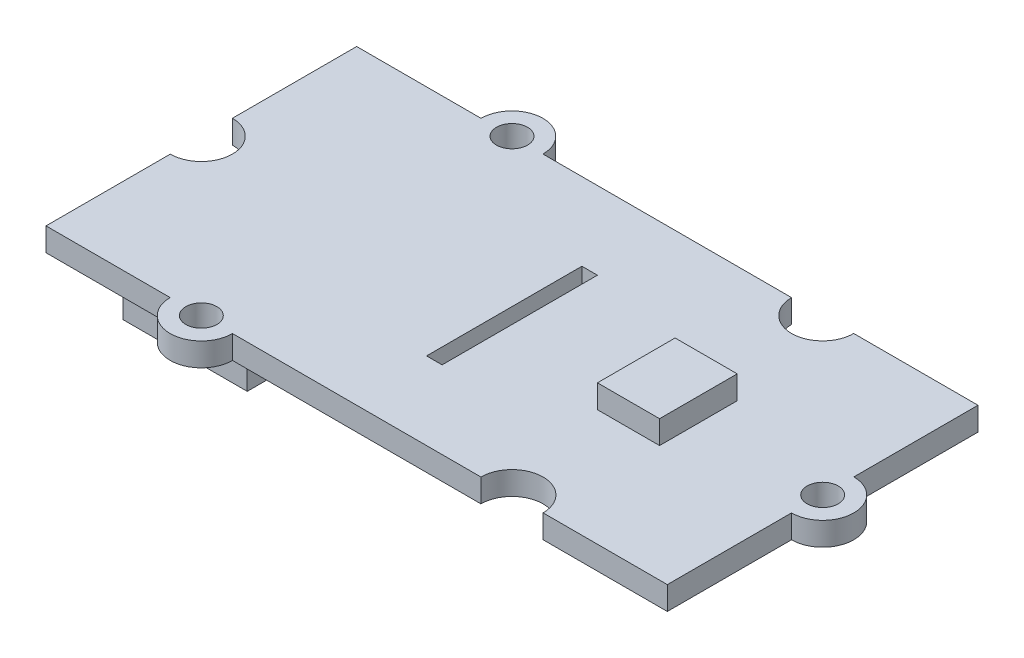
ISO-10303-21;
HEADER;
FILE_DESCRIPTION(('STEP AP214'),'2;1');
FILE_NAME('part.step','',(''),(''),'','','');
FILE_SCHEMA(('AUTOMOTIVE_DESIGN { 1 0 10303 214 1 1 1 1 }'));
ENDSEC;
DATA;
#1=APPLICATION_CONTEXT('core data for automotive mechanical design processes');
#2=APPLICATION_PROTOCOL_DEFINITION('international standard','automotive_design',2000,#1);
#3=PRODUCT_CONTEXT('',#1,'mechanical');
#4=PRODUCT('Part','Part','',(#3));
#5=PRODUCT_RELATED_PRODUCT_CATEGORY('part','',(#4));
#6=PRODUCT_DEFINITION_FORMATION('','',#4);
#7=PRODUCT_DEFINITION_CONTEXT('part definition',#1,'design');
#8=PRODUCT_DEFINITION('design','',#6,#7);
#9=PRODUCT_DEFINITION_SHAPE('','',#8);
#10=(LENGTH_UNIT() NAMED_UNIT(*) SI_UNIT(.MILLI.,.METRE.));
#11=(NAMED_UNIT(*) PLANE_ANGLE_UNIT() SI_UNIT($,.RADIAN.));
#12=(NAMED_UNIT(*) SI_UNIT($,.STERADIAN.) SOLID_ANGLE_UNIT());
#13=UNCERTAINTY_MEASURE_WITH_UNIT(LENGTH_MEASURE(1.E-05),#10,'distance_accuracy_value','');
#14=(GEOMETRIC_REPRESENTATION_CONTEXT(3) GLOBAL_UNCERTAINTY_ASSIGNED_CONTEXT((#13)) GLOBAL_UNIT_ASSIGNED_CONTEXT((#10,
#11,#12)) REPRESENTATION_CONTEXT('',''));
#15=CARTESIAN_POINT('',(0.,0.,0.));
#16=DIRECTION('',(0.,0.,1.));
#17=DIRECTION('',(1.,0.,0.));
#18=AXIS2_PLACEMENT_3D('',#15,#16,#17);
#19=CARTESIAN_POINT('',(0.,1.5,0.));
#20=DIRECTION('',(0.,1.,0.));
#21=DIRECTION('',(0.,0.,1.));
#22=AXIS2_PLACEMENT_3D('',#19,#20,#21);
#23=PLANE('',#22);
#24=CARTESIAN_POINT('',(-10.,1.5,10.));
#25=DIRECTION('',(0.,1.,0.));
#26=DIRECTION('',(0.,0.,1.));
#27=AXIS2_PLACEMENT_3D('',#24,#25,#26);
#28=CIRCLE('',#27,1.);
#29=CARTESIAN_POINT('',(-10.,1.5,11.));
#30=VERTEX_POINT('',#29);
#31=EDGE_CURVE('E298',#30,#30,#28,.T.);
#32=ORIENTED_EDGE('',*,*,#31,.F.);
#33=EDGE_LOOP('',(#32));
#34=FACE_BOUND('',#33,.T.);
#35=CARTESIAN_POINT('',(20.,1.5,0.));
#36=DIRECTION('',(0.,1.,0.));
#37=DIRECTION('',(0.,0.,1.));
#38=AXIS2_PLACEMENT_3D('',#35,#36,#37);
#39=CIRCLE('',#38,1.);
#40=CARTESIAN_POINT('',(20.,1.5,1.));
#41=VERTEX_POINT('',#40);
#42=EDGE_CURVE('E301',#41,#41,#39,.T.);
#43=ORIENTED_EDGE('',*,*,#42,.F.);
#44=EDGE_LOOP('',(#43));
#45=FACE_BOUND('',#44,.T.);
#46=DIRECTION('',(1.,0.,0.));
#47=VECTOR('',#46,1.);
#48=CARTESIAN_POINT('',(0.,1.5,-10.));
#49=LINE('',#48,#47);
#50=CARTESIAN_POINT('',(-8.00644597857988,1.5,-10.));
#51=VERTEX_POINT('',#50);
#52=CARTESIAN_POINT('',(8.,1.5,-10.));
#53=VERTEX_POINT('',#52);
#54=EDGE_CURVE('E305',#51,#53,#49,.T.);
#55=ORIENTED_EDGE('',*,*,#54,.F.);
#56=CARTESIAN_POINT('',(-10.,1.5,-10.));
#57=DIRECTION('',(0.,1.,0.));
#58=DIRECTION('',(0.,0.,1.));
#59=AXIS2_PLACEMENT_3D('',#56,#57,#58);
#60=CIRCLE('',#59,1.99355402142012);
#61=CARTESIAN_POINT('',(-11.9935540214201,1.5,-10.));
#62=VERTEX_POINT('',#61);
#63=EDGE_CURVE('E308',#51,#62,#60,.T.);
#64=ORIENTED_EDGE('',*,*,#63,.T.);
#65=CARTESIAN_POINT('',(-20.,1.5,-10.));
#66=VERTEX_POINT('',#65);
#67=EDGE_CURVE('E310',#66,#62,#49,.T.);
#68=ORIENTED_EDGE('',*,*,#67,.F.);
#69=DIRECTION('',(0.,0.,-1.));
#70=VECTOR('',#69,1.);
#71=CARTESIAN_POINT('',(-20.,1.5,0.));
#72=LINE('',#71,#70);
#73=CARTESIAN_POINT('',(-20.,1.5,-2.));
#74=VERTEX_POINT('',#73);
#75=EDGE_CURVE('E312',#74,#66,#72,.T.);
#76=ORIENTED_EDGE('',*,*,#75,.F.);
#77=CARTESIAN_POINT('',(-20.,1.5,0.));
#78=DIRECTION('',(0.,1.,0.));
#79=DIRECTION('',(0.,0.,1.));
#80=AXIS2_PLACEMENT_3D('',#77,#78,#79);
#81=CIRCLE('',#80,2.);
#82=CARTESIAN_POINT('',(-20.,1.5,2.));
#83=VERTEX_POINT('',#82);
#84=EDGE_CURVE('E315',#83,#74,#81,.T.);
#85=ORIENTED_EDGE('',*,*,#84,.F.);
#86=CARTESIAN_POINT('',(-20.,1.5,10.));
#87=VERTEX_POINT('',#86);
#88=EDGE_CURVE('E316',#87,#83,#72,.T.);
#89=ORIENTED_EDGE('',*,*,#88,.F.);
#90=DIRECTION('',(1.,0.,0.));
#91=VECTOR('',#90,1.);
#92=CARTESIAN_POINT('',(0.,1.5,10.));
#93=LINE('',#92,#91);
#94=CARTESIAN_POINT('',(-12.0064459785799,1.5,10.));
#95=VERTEX_POINT('',#94);
#96=EDGE_CURVE('E319',#87,#95,#93,.T.);
#97=ORIENTED_EDGE('',*,*,#96,.T.);
#98=CARTESIAN_POINT('',(-10.,1.5,10.));
#99=DIRECTION('',(0.,1.,0.));
#100=DIRECTION('',(0.,0.,1.));
#101=AXIS2_PLACEMENT_3D('',#98,#99,#100);
#102=CIRCLE('',#101,2.00644597857989);
#103=CARTESIAN_POINT('',(-7.99355402142011,1.5,10.));
#104=VERTEX_POINT('',#103);
#105=EDGE_CURVE('E322',#95,#104,#102,.T.);
#106=ORIENTED_EDGE('',*,*,#105,.T.);
#107=CARTESIAN_POINT('',(8.,1.5,10.));
#108=VERTEX_POINT('',#107);
#109=EDGE_CURVE('E324',#104,#108,#93,.T.);
#110=ORIENTED_EDGE('',*,*,#109,.T.);
#111=CARTESIAN_POINT('',(10.,1.5,10.));
#112=DIRECTION('',(0.,1.,0.));
#113=DIRECTION('',(0.,0.,1.));
#114=AXIS2_PLACEMENT_3D('',#111,#112,#113);
#115=CIRCLE('',#114,2.);
#116=CARTESIAN_POINT('',(12.,1.5,10.));
#117=VERTEX_POINT('',#116);
#118=EDGE_CURVE('E327',#117,#108,#115,.T.);
#119=ORIENTED_EDGE('',*,*,#118,.F.);
#120=CARTESIAN_POINT('',(20.,1.5,10.));
#121=VERTEX_POINT('',#120);
#122=EDGE_CURVE('E323',#117,#121,#93,.T.);
#123=ORIENTED_EDGE('',*,*,#122,.T.);
#124=DIRECTION('',(0.,0.,-1.));
#125=VECTOR('',#124,1.);
#126=CARTESIAN_POINT('',(20.,1.5,0.));
#127=LINE('',#126,#125);
#128=CARTESIAN_POINT('',(20.,1.5,2.00644597857989));
#129=VERTEX_POINT('',#128);
#130=EDGE_CURVE('E330',#121,#129,#127,.T.);
#131=ORIENTED_EDGE('',*,*,#130,.T.);
#132=CARTESIAN_POINT('',(20.,1.5,0.));
#133=DIRECTION('',(0.,1.,0.));
#134=DIRECTION('',(0.,0.,1.));
#135=AXIS2_PLACEMENT_3D('',#132,#133,#134);
#136=CIRCLE('',#135,2.00644597857989);
#137=CARTESIAN_POINT('',(20.,1.5,-2.00644597857989));
#138=VERTEX_POINT('',#137);
#139=EDGE_CURVE('E333',#129,#138,#136,.T.);
#140=ORIENTED_EDGE('',*,*,#139,.T.);
#141=CARTESIAN_POINT('',(20.,1.5,-10.));
#142=VERTEX_POINT('',#141);
#143=EDGE_CURVE('E334',#138,#142,#127,.T.);
#144=ORIENTED_EDGE('',*,*,#143,.T.);
#145=CARTESIAN_POINT('',(12.,1.5,-10.));
#146=VERTEX_POINT('',#145);
#147=EDGE_CURVE('E309',#146,#142,#49,.T.);
#148=ORIENTED_EDGE('',*,*,#147,.F.);
#149=CARTESIAN_POINT('',(10.,1.5,-10.));
#150=DIRECTION('',(0.,1.,0.));
#151=DIRECTION('',(0.,0.,1.));
#152=AXIS2_PLACEMENT_3D('',#149,#150,#151);
#153=CIRCLE('',#152,2.);
#154=EDGE_CURVE('E337',#53,#146,#153,.T.);
#155=ORIENTED_EDGE('',*,*,#154,.F.);
#156=EDGE_LOOP('',(#55,#64,#68,#76,#85,#89,#97,#106,#110,#119,#123,#131,#140,#144,#148,#155));
#157=FACE_BOUND('',#156,.T.);
#158=CARTESIAN_POINT('',(-10.,1.5,-10.));
#159=DIRECTION('',(0.,1.,0.));
#160=DIRECTION('',(0.,0.,1.));
#161=AXIS2_PLACEMENT_3D('',#158,#159,#160);
#162=CIRCLE('',#161,1.);
#163=CARTESIAN_POINT('',(-10.,1.5,-9.));
#164=VERTEX_POINT('',#163);
#165=EDGE_CURVE('E340',#164,#164,#162,.T.);
#166=ORIENTED_EDGE('',*,*,#165,.F.);
#167=EDGE_LOOP('',(#166));
#168=FACE_BOUND('',#167,.T.);
#169=DIRECTION('',(0.,0.,-1.));
#170=VECTOR('',#169,1.);
#171=CARTESIAN_POINT('',(0.5,1.5,0.));
#172=LINE('',#171,#170);
#173=CARTESIAN_POINT('',(0.5,1.5,5.));
#174=VERTEX_POINT('',#173);
#175=CARTESIAN_POINT('',(0.5,1.5,-5.));
#176=VERTEX_POINT('',#175);
#177=EDGE_CURVE('E343',#174,#176,#172,.T.);
#178=ORIENTED_EDGE('',*,*,#177,.F.);
#179=DIRECTION('',(1.,0.,0.));
#180=VECTOR('',#179,1.);
#181=CARTESIAN_POINT('',(0.,1.5,5.));
#182=LINE('',#181,#180);
#183=CARTESIAN_POINT('',(-0.5,1.5,5.));
#184=VERTEX_POINT('',#183);
#185=EDGE_CURVE('E346',#184,#174,#182,.T.);
#186=ORIENTED_EDGE('',*,*,#185,.F.);
#187=DIRECTION('',(0.,0.,-1.));
#188=VECTOR('',#187,1.);
#189=CARTESIAN_POINT('',(-0.5,1.5,0.));
#190=LINE('',#189,#188);
#191=CARTESIAN_POINT('',(-0.5,1.5,-5.));
#192=VERTEX_POINT('',#191);
#193=EDGE_CURVE('E349',#184,#192,#190,.T.);
#194=ORIENTED_EDGE('',*,*,#193,.T.);
#195=DIRECTION('',(1.,0.,0.));
#196=VECTOR('',#195,1.);
#197=CARTESIAN_POINT('',(0.,1.5,-5.));
#198=LINE('',#197,#196);
#199=EDGE_CURVE('E352',#192,#176,#198,.T.);
#200=ORIENTED_EDGE('',*,*,#199,.T.);
#201=EDGE_LOOP('',(#178,#186,#194,#200));
#202=FACE_BOUND('',#201,.T.);
#203=DIRECTION('',(-1.,0.,0.));
#204=VECTOR('',#203,1.);
#205=CARTESIAN_POINT('',(8.,1.5,-2.5));
#206=LINE('',#205,#204);
#207=CARTESIAN_POINT('',(12.,1.5,-2.5));
#208=VERTEX_POINT('',#207);
#209=CARTESIAN_POINT('',(8.,1.5,-2.5));
#210=VERTEX_POINT('',#209);
#211=EDGE_CURVE('E284',#208,#210,#206,.T.);
#212=ORIENTED_EDGE('',*,*,#211,.F.);
#213=DIRECTION('',(0.,0.,-1.));
#214=VECTOR('',#213,1.);
#215=CARTESIAN_POINT('',(12.,1.5,2.5));
#216=LINE('',#215,#214);
#217=CARTESIAN_POINT('',(12.,1.5,2.5));
#218=VERTEX_POINT('',#217);
#219=EDGE_CURVE('E267',#218,#208,#216,.T.);
#220=ORIENTED_EDGE('',*,*,#219,.F.);
#221=DIRECTION('',(1.,0.,0.));
#222=VECTOR('',#221,1.);
#223=CARTESIAN_POINT('',(8.,1.5,2.5));
#224=LINE('',#223,#222);
#225=CARTESIAN_POINT('',(8.,1.5,2.5));
#226=VERTEX_POINT('',#225);
#227=EDGE_CURVE('E275',#226,#218,#224,.T.);
#228=ORIENTED_EDGE('',*,*,#227,.F.);
#229=DIRECTION('',(0.,0.,1.));
#230=VECTOR('',#229,1.);
#231=CARTESIAN_POINT('',(8.,1.5,2.5));
#232=LINE('',#231,#230);
#233=EDGE_CURVE('E286',#210,#226,#232,.T.);
#234=ORIENTED_EDGE('',*,*,#233,.F.);
#235=EDGE_LOOP('',(#212,#220,#228,#234));
#236=FACE_BOUND('',#235,.T.);
#237=ADVANCED_FACE('F38',(#34,#45,#157,#168,#202,#236),#23,.T.);
#238=CARTESIAN_POINT('',(0.5,1.5,0.));
#239=DIRECTION('',(-1.,0.,0.));
#240=DIRECTION('',(0.,0.,1.));
#241=AXIS2_PLACEMENT_3D('',#238,#239,#240);
#242=PLANE('',#241);
#243=DIRECTION('',(0.,0.,-1.));
#244=VECTOR('',#243,1.);
#245=CARTESIAN_POINT('',(0.5,0.,0.));
#246=LINE('',#245,#244);
#247=CARTESIAN_POINT('',(0.5,0.,5.));
#248=VERTEX_POINT('',#247);
#249=CARTESIAN_POINT('',(0.5,0.,-5.));
#250=VERTEX_POINT('',#249);
#251=EDGE_CURVE('E401',#248,#250,#246,.T.);
#252=ORIENTED_EDGE('',*,*,#251,.F.);
#253=DIRECTION('',(0.,-1.,0.));
#254=VECTOR('',#253,1.);
#255=CARTESIAN_POINT('',(0.5,1.5,5.));
#256=LINE('',#255,#254);
#257=EDGE_CURVE('E47',#174,#248,#256,.T.);
#258=ORIENTED_EDGE('',*,*,#257,.F.);
#259=ORIENTED_EDGE('',*,*,#177,.T.);
#260=DIRECTION('',(0.,-1.,0.));
#261=VECTOR('',#260,1.);
#262=CARTESIAN_POINT('',(0.5,1.5,-5.));
#263=LINE('',#262,#261);
#264=EDGE_CURVE('E412',#176,#250,#263,.T.);
#265=ORIENTED_EDGE('',*,*,#264,.T.);
#266=EDGE_LOOP('',(#252,#258,#259,#265));
#267=FACE_BOUND('',#266,.T.);
#268=ADVANCED_FACE('F553',(#267),#242,.T.);
#269=CARTESIAN_POINT('',(0.,1.5,5.));
#270=DIRECTION('',(0.,0.,-1.));
#271=DIRECTION('',(-1.,0.,0.));
#272=AXIS2_PLACEMENT_3D('',#269,#270,#271);
#273=PLANE('',#272);
#274=DIRECTION('',(1.,0.,0.));
#275=VECTOR('',#274,1.);
#276=CARTESIAN_POINT('',(0.,0.,5.));
#277=LINE('',#276,#275);
#278=CARTESIAN_POINT('',(-0.5,0.,5.));
#279=VERTEX_POINT('',#278);
#280=EDGE_CURVE('E404',#279,#248,#277,.T.);
#281=ORIENTED_EDGE('',*,*,#280,.F.);
#282=DIRECTION('',(0.,-1.,0.));
#283=VECTOR('',#282,1.);
#284=CARTESIAN_POINT('',(-0.5,1.5,5.));
#285=LINE('',#284,#283);
#286=EDGE_CURVE('E417',#184,#279,#285,.T.);
#287=ORIENTED_EDGE('',*,*,#286,.F.);
#288=ORIENTED_EDGE('',*,*,#185,.T.);
#289=ORIENTED_EDGE('',*,*,#257,.T.);
#290=EDGE_LOOP('',(#281,#287,#288,#289));
#291=FACE_BOUND('',#290,.T.);
#292=ADVANCED_FACE('F559',(#291),#273,.T.);
#293=CARTESIAN_POINT('',(-0.5,1.5,0.));
#294=DIRECTION('',(-1.,0.,0.));
#295=DIRECTION('',(0.,0.,1.));
#296=AXIS2_PLACEMENT_3D('',#293,#294,#295);
#297=PLANE('',#296);
#298=DIRECTION('',(0.,0.,-1.));
#299=VECTOR('',#298,1.);
#300=CARTESIAN_POINT('',(-0.5,0.,0.));
#301=LINE('',#300,#299);
#302=CARTESIAN_POINT('',(-0.5,0.,-5.));
#303=VERTEX_POINT('',#302);
#304=EDGE_CURVE('E407',#279,#303,#301,.T.);
#305=ORIENTED_EDGE('',*,*,#304,.T.);
#306=DIRECTION('',(0.,-1.,0.));
#307=VECTOR('',#306,1.);
#308=CARTESIAN_POINT('',(-0.5,1.5,-5.));
#309=LINE('',#308,#307);
#310=EDGE_CURVE('E414',#192,#303,#309,.T.);
#311=ORIENTED_EDGE('',*,*,#310,.F.);
#312=ORIENTED_EDGE('',*,*,#193,.F.);
#313=ORIENTED_EDGE('',*,*,#286,.T.);
#314=EDGE_LOOP('',(#305,#311,#312,#313));
#315=FACE_BOUND('',#314,.T.);
#316=ADVANCED_FACE('F551',(#315),#297,.F.);
#317=CARTESIAN_POINT('',(0.,1.5,-10.));
#318=DIRECTION('',(0.,0.,-1.));
#319=DIRECTION('',(-1.,0.,0.));
#320=AXIS2_PLACEMENT_3D('',#317,#318,#319);
#321=PLANE('',#320);
#322=DIRECTION('',(1.,0.,0.));
#323=VECTOR('',#322,1.);
#324=CARTESIAN_POINT('',(0.,0.,-10.));
#325=LINE('',#324,#323);
#326=CARTESIAN_POINT('',(-8.00644597857988,0.,-10.));
#327=VERTEX_POINT('',#326);
#328=CARTESIAN_POINT('',(8.,0.,-10.));
#329=VERTEX_POINT('',#328);
#330=EDGE_CURVE('E360',#327,#329,#325,.T.);
#331=ORIENTED_EDGE('',*,*,#330,.F.);
#332=DIRECTION('',(0.,-1.,0.));
#333=VECTOR('',#332,1.);
#334=CARTESIAN_POINT('',(-8.00644597857988,1.5,-10.));
#335=LINE('',#334,#333);
#336=EDGE_CURVE('E42',#51,#327,#335,.T.);
#337=ORIENTED_EDGE('',*,*,#336,.F.);
#338=ORIENTED_EDGE('',*,*,#54,.T.);
#339=DIRECTION('',(0.,-1.,0.));
#340=VECTOR('',#339,1.);
#341=CARTESIAN_POINT('',(8.,1.5,-10.));
#342=LINE('',#341,#340);
#343=EDGE_CURVE('E354',#53,#329,#342,.T.);
#344=ORIENTED_EDGE('',*,*,#343,.T.);
#345=EDGE_LOOP('',(#331,#337,#338,#344));
#346=FACE_BOUND('',#345,.T.);
#347=ADVANCED_FACE('F469',(#346),#321,.T.);
#348=CARTESIAN_POINT('',(-10.,1.5,-10.));
#349=DIRECTION('',(0.,-1.,0.));
#350=DIRECTION('',(0.,0.,-1.));
#351=AXIS2_PLACEMENT_3D('',#348,#349,#350);
#352=CYLINDRICAL_SURFACE('',#351,1.99355402142012);
#353=CARTESIAN_POINT('',(-10.,0.,-10.));
#354=DIRECTION('',(0.,1.,0.));
#355=DIRECTION('',(0.,0.,1.));
#356=AXIS2_PLACEMENT_3D('',#353,#354,#355);
#357=CIRCLE('',#356,1.99355402142012);
#358=CARTESIAN_POINT('',(-11.9935540214201,0.,-10.));
#359=VERTEX_POINT('',#358);
#360=EDGE_CURVE('E363',#327,#359,#357,.T.);
#361=ORIENTED_EDGE('',*,*,#360,.T.);
#362=DIRECTION('',(0.,-1.,0.));
#363=VECTOR('',#362,1.);
#364=CARTESIAN_POINT('',(-11.9935540214201,1.5,-10.));
#365=LINE('',#364,#363);
#366=EDGE_CURVE('E452',#62,#359,#365,.T.);
#367=ORIENTED_EDGE('',*,*,#366,.F.);
#368=ORIENTED_EDGE('',*,*,#63,.F.);
#369=ORIENTED_EDGE('',*,*,#336,.T.);
#370=EDGE_LOOP('',(#361,#367,#368,#369));
#371=FACE_BOUND('',#370,.T.);
#372=ADVANCED_FACE('F460',(#371),#352,.T.);
#373=CARTESIAN_POINT('',(-20.,0.,-10.));
#374=VERTEX_POINT('',#373);
#375=EDGE_CURVE('E365',#374,#359,#325,.T.);
#376=ORIENTED_EDGE('',*,*,#375,.F.);
#377=DIRECTION('',(0.,-1.,0.));
#378=VECTOR('',#377,1.);
#379=CARTESIAN_POINT('',(-20.,1.5,-10.));
#380=LINE('',#379,#378);
#381=EDGE_CURVE('E451',#66,#374,#380,.T.);
#382=ORIENTED_EDGE('',*,*,#381,.F.);
#383=ORIENTED_EDGE('',*,*,#67,.T.);
#384=ORIENTED_EDGE('',*,*,#366,.T.);
#385=EDGE_LOOP('',(#376,#382,#383,#384));
#386=FACE_BOUND('',#385,.T.);
#387=ADVANCED_FACE('F536',(#386),#321,.T.);
#388=CARTESIAN_POINT('',(-20.,1.5,0.));
#389=DIRECTION('',(-1.,0.,0.));
#390=DIRECTION('',(0.,0.,1.));
#391=AXIS2_PLACEMENT_3D('',#388,#389,#390);
#392=PLANE('',#391);
#393=DIRECTION('',(0.,0.,-1.));
#394=VECTOR('',#393,1.);
#395=CARTESIAN_POINT('',(-20.,0.,0.));
#396=LINE('',#395,#394);
#397=CARTESIAN_POINT('',(-20.,0.,-2.));
#398=VERTEX_POINT('',#397);
#399=EDGE_CURVE('E368',#398,#374,#396,.T.);
#400=ORIENTED_EDGE('',*,*,#399,.F.);
#401=DIRECTION('',(0.,-1.,0.));
#402=VECTOR('',#401,1.);
#403=CARTESIAN_POINT('',(-20.,1.5,-2.));
#404=LINE('',#403,#402);
#405=EDGE_CURVE('E448',#74,#398,#404,.T.);
#406=ORIENTED_EDGE('',*,*,#405,.F.);
#407=ORIENTED_EDGE('',*,*,#75,.T.);
#408=ORIENTED_EDGE('',*,*,#381,.T.);
#409=EDGE_LOOP('',(#400,#406,#407,#408));
#410=FACE_BOUND('',#409,.T.);
#411=ADVANCED_FACE('F534',(#410),#392,.T.);
#412=CARTESIAN_POINT('',(-20.,1.5,0.));
#413=DIRECTION('',(0.,-1.,0.));
#414=DIRECTION('',(0.,0.,-1.));
#415=AXIS2_PLACEMENT_3D('',#412,#413,#414);
#416=CYLINDRICAL_SURFACE('',#415,2.);
#417=CARTESIAN_POINT('',(-20.,0.,0.));
#418=DIRECTION('',(0.,1.,0.));
#419=DIRECTION('',(0.,0.,1.));
#420=AXIS2_PLACEMENT_3D('',#417,#418,#419);
#421=CIRCLE('',#420,2.);
#422=CARTESIAN_POINT('',(-20.,0.,2.));
#423=VERTEX_POINT('',#422);
#424=CARTESIAN_POINT('',(-19.0442173323359,0.,1.75683792428124));
#425=VERTEX_POINT('',#424);
#426=EDGE_CURVE('E373',#423,#425,#421,.T.);
#427=ORIENTED_EDGE('',*,*,#426,.F.);
#428=DIRECTION('',(0.,-1.,0.));
#429=VECTOR('',#428,1.);
#430=CARTESIAN_POINT('',(-20.,1.5,2.));
#431=LINE('',#430,#429);
#432=EDGE_CURVE('E446',#83,#423,#431,.T.);
#433=ORIENTED_EDGE('',*,*,#432,.F.);
#434=ORIENTED_EDGE('',*,*,#84,.T.);
#435=ORIENTED_EDGE('',*,*,#405,.T.);
#436=CARTESIAN_POINT('',(-19.0442173323359,0.,-1.75683792428124));
#437=VERTEX_POINT('',#436);
#438=EDGE_CURVE('E371',#437,#398,#421,.T.);
#439=ORIENTED_EDGE('',*,*,#438,.F.);
#440=EDGE_CURVE('E376',#425,#437,#421,.T.);
#441=ORIENTED_EDGE('',*,*,#440,.F.);
#442=EDGE_LOOP('',(#427,#433,#434,#435,#439,#441));
#443=FACE_BOUND('',#442,.T.);
#444=ADVANCED_FACE('F521',(#443),#416,.F.);
#445=CARTESIAN_POINT('',(-20.,0.,10.));
#446=VERTEX_POINT('',#445);
#447=EDGE_CURVE('E372',#446,#423,#396,.T.);
#448=ORIENTED_EDGE('',*,*,#447,.F.);
#449=DIRECTION('',(0.,-1.,0.));
#450=VECTOR('',#449,1.);
#451=CARTESIAN_POINT('',(-20.,1.5,10.));
#452=LINE('',#451,#450);
#453=EDGE_CURVE('E444',#87,#446,#452,.T.);
#454=ORIENTED_EDGE('',*,*,#453,.F.);
#455=ORIENTED_EDGE('',*,*,#88,.T.);
#456=ORIENTED_EDGE('',*,*,#432,.T.);
#457=EDGE_LOOP('',(#448,#454,#455,#456));
#458=FACE_BOUND('',#457,.T.);
#459=ADVANCED_FACE('F515',(#458),#392,.T.);
#460=CARTESIAN_POINT('',(0.,1.5,10.));
#461=DIRECTION('',(0.,0.,-1.));
#462=DIRECTION('',(-1.,0.,0.));
#463=AXIS2_PLACEMENT_3D('',#460,#461,#462);
#464=PLANE('',#463);
#465=DIRECTION('',(1.,0.,0.));
#466=VECTOR('',#465,1.);
#467=CARTESIAN_POINT('',(0.,0.,10.));
#468=LINE('',#467,#466);
#469=CARTESIAN_POINT('',(-12.0064459785799,0.,10.));
#470=VERTEX_POINT('',#469);
#471=EDGE_CURVE('E377',#446,#470,#468,.T.);
#472=ORIENTED_EDGE('',*,*,#471,.T.);
#473=DIRECTION('',(0.,-1.,0.));
#474=VECTOR('',#473,1.);
#475=CARTESIAN_POINT('',(-12.0064459785799,1.5,10.));
#476=LINE('',#475,#474);
#477=EDGE_CURVE('E441',#95,#470,#476,.T.);
#478=ORIENTED_EDGE('',*,*,#477,.F.);
#479=ORIENTED_EDGE('',*,*,#96,.F.);
#480=ORIENTED_EDGE('',*,*,#453,.T.);
#481=EDGE_LOOP('',(#472,#478,#479,#480));
#482=FACE_BOUND('',#481,.T.);
#483=ADVANCED_FACE('F598',(#482),#464,.F.);
#484=CARTESIAN_POINT('',(-10.,1.5,10.));
#485=DIRECTION('',(0.,-1.,0.));
#486=DIRECTION('',(0.,0.,-1.));
#487=AXIS2_PLACEMENT_3D('',#484,#485,#486);
#488=CYLINDRICAL_SURFACE('',#487,2.00644597857989);
#489=CARTESIAN_POINT('',(-10.,0.,10.));
#490=DIRECTION('',(0.,1.,0.));
#491=DIRECTION('',(0.,0.,1.));
#492=AXIS2_PLACEMENT_3D('',#489,#490,#491);
#493=CIRCLE('',#492,2.00644597857989);
#494=CARTESIAN_POINT('',(-7.99355402142011,0.,10.));
#495=VERTEX_POINT('',#494);
#496=EDGE_CURVE('E380',#470,#495,#493,.T.);
#497=ORIENTED_EDGE('',*,*,#496,.T.);
#498=DIRECTION('',(0.,-1.,0.));
#499=VECTOR('',#498,1.);
#500=CARTESIAN_POINT('',(-7.99355402142011,1.5,10.));
#501=LINE('',#500,#499);
#502=EDGE_CURVE('E438',#104,#495,#501,.T.);
#503=ORIENTED_EDGE('',*,*,#502,.F.);
#504=ORIENTED_EDGE('',*,*,#105,.F.);
#505=ORIENTED_EDGE('',*,*,#477,.T.);
#506=EDGE_LOOP('',(#497,#503,#504,#505));
#507=FACE_BOUND('',#506,.T.);
#508=ADVANCED_FACE('F509',(#507),#488,.T.);
#509=CARTESIAN_POINT('',(8.,0.,10.));
#510=VERTEX_POINT('',#509);
#511=EDGE_CURVE('E382',#495,#510,#468,.T.);
#512=ORIENTED_EDGE('',*,*,#511,.T.);
#513=DIRECTION('',(0.,-1.,0.));
#514=VECTOR('',#513,1.);
#515=CARTESIAN_POINT('',(8.,1.5,10.));
#516=LINE('',#515,#514);
#517=EDGE_CURVE('E436',#108,#510,#516,.T.);
#518=ORIENTED_EDGE('',*,*,#517,.F.);
#519=ORIENTED_EDGE('',*,*,#109,.F.);
#520=ORIENTED_EDGE('',*,*,#502,.T.);
#521=EDGE_LOOP('',(#512,#518,#519,#520));
#522=FACE_BOUND('',#521,.T.);
#523=ADVANCED_FACE('F498',(#522),#464,.F.);
#524=CARTESIAN_POINT('',(10.,1.5,10.));
#525=DIRECTION('',(0.,-1.,0.));
#526=DIRECTION('',(0.,0.,-1.));
#527=AXIS2_PLACEMENT_3D('',#524,#525,#526);
#528=CYLINDRICAL_SURFACE('',#527,2.);
#529=CARTESIAN_POINT('',(10.,0.,10.));
#530=DIRECTION('',(0.,1.,0.));
#531=DIRECTION('',(0.,0.,1.));
#532=AXIS2_PLACEMENT_3D('',#529,#530,#531);
#533=CIRCLE('',#532,2.);
#534=CARTESIAN_POINT('',(12.,0.,10.));
#535=VERTEX_POINT('',#534);
#536=EDGE_CURVE('E385',#535,#510,#533,.T.);
#537=ORIENTED_EDGE('',*,*,#536,.F.);
#538=DIRECTION('',(0.,-1.,0.));
#539=VECTOR('',#538,1.);
#540=CARTESIAN_POINT('',(12.,1.5,10.));
#541=LINE('',#540,#539);
#542=EDGE_CURVE('E434',#117,#535,#541,.T.);
#543=ORIENTED_EDGE('',*,*,#542,.F.);
#544=ORIENTED_EDGE('',*,*,#118,.T.);
#545=ORIENTED_EDGE('',*,*,#517,.T.);
#546=EDGE_LOOP('',(#537,#543,#544,#545));
#547=FACE_BOUND('',#546,.T.);
#548=ADVANCED_FACE('F501',(#547),#528,.F.);
#549=CARTESIAN_POINT('',(20.,0.,10.));
#550=VERTEX_POINT('',#549);
#551=EDGE_CURVE('E381',#535,#550,#468,.T.);
#552=ORIENTED_EDGE('',*,*,#551,.T.);
#553=DIRECTION('',(0.,-1.,0.));
#554=VECTOR('',#553,1.);
#555=CARTESIAN_POINT('',(20.,1.5,10.));
#556=LINE('',#555,#554);
#557=EDGE_CURVE('E431',#121,#550,#556,.T.);
#558=ORIENTED_EDGE('',*,*,#557,.F.);
#559=ORIENTED_EDGE('',*,*,#122,.F.);
#560=ORIENTED_EDGE('',*,*,#542,.T.);
#561=EDGE_LOOP('',(#552,#558,#559,#560));
#562=FACE_BOUND('',#561,.T.);
#563=ADVANCED_FACE('F494',(#562),#464,.F.);
#564=CARTESIAN_POINT('',(20.,1.5,0.));
#565=DIRECTION('',(-1.,0.,0.));
#566=DIRECTION('',(0.,0.,1.));
#567=AXIS2_PLACEMENT_3D('',#564,#565,#566);
#568=PLANE('',#567);
#569=DIRECTION('',(0.,0.,-1.));
#570=VECTOR('',#569,1.);
#571=CARTESIAN_POINT('',(20.,0.,0.));
#572=LINE('',#571,#570);
#573=CARTESIAN_POINT('',(20.,0.,2.00644597857989));
#574=VERTEX_POINT('',#573);
#575=EDGE_CURVE('E388',#550,#574,#572,.T.);
#576=ORIENTED_EDGE('',*,*,#575,.T.);
#577=DIRECTION('',(0.,-1.,0.));
#578=VECTOR('',#577,1.);
#579=CARTESIAN_POINT('',(20.,1.5,2.00644597857989));
#580=LINE('',#579,#578);
#581=EDGE_CURVE('E428',#129,#574,#580,.T.);
#582=ORIENTED_EDGE('',*,*,#581,.F.);
#583=ORIENTED_EDGE('',*,*,#130,.F.);
#584=ORIENTED_EDGE('',*,*,#557,.T.);
#585=EDGE_LOOP('',(#576,#582,#583,#584));
#586=FACE_BOUND('',#585,.T.);
#587=ADVANCED_FACE('F490',(#586),#568,.F.);
#588=CARTESIAN_POINT('',(20.,1.5,0.));
#589=DIRECTION('',(0.,-1.,0.));
#590=DIRECTION('',(0.,0.,-1.));
#591=AXIS2_PLACEMENT_3D('',#588,#589,#590);
#592=CYLINDRICAL_SURFACE('',#591,2.00644597857989);
#593=CARTESIAN_POINT('',(20.,0.,0.));
#594=DIRECTION('',(0.,1.,0.));
#595=DIRECTION('',(0.,0.,1.));
#596=AXIS2_PLACEMENT_3D('',#593,#594,#595);
#597=CIRCLE('',#596,2.00644597857989);
#598=CARTESIAN_POINT('',(20.,0.,-2.00644597857989));
#599=VERTEX_POINT('',#598);
#600=EDGE_CURVE('E391',#574,#599,#597,.T.);
#601=ORIENTED_EDGE('',*,*,#600,.T.);
#602=DIRECTION('',(0.,-1.,0.));
#603=VECTOR('',#602,1.);
#604=CARTESIAN_POINT('',(20.,1.5,-2.00644597857989));
#605=LINE('',#604,#603);
#606=EDGE_CURVE('E425',#138,#599,#605,.T.);
#607=ORIENTED_EDGE('',*,*,#606,.F.);
#608=ORIENTED_EDGE('',*,*,#139,.F.);
#609=ORIENTED_EDGE('',*,*,#581,.T.);
#610=EDGE_LOOP('',(#601,#607,#608,#609));
#611=FACE_BOUND('',#610,.T.);
#612=ADVANCED_FACE('F483',(#611),#592,.T.);
#613=CARTESIAN_POINT('',(20.,0.,-10.));
#614=VERTEX_POINT('',#613);
#615=EDGE_CURVE('E392',#599,#614,#572,.T.);
#616=ORIENTED_EDGE('',*,*,#615,.T.);
#617=DIRECTION('',(0.,-1.,0.));
#618=VECTOR('',#617,1.);
#619=CARTESIAN_POINT('',(20.,1.5,-10.));
#620=LINE('',#619,#618);
#621=EDGE_CURVE('E423',#142,#614,#620,.T.);
#622=ORIENTED_EDGE('',*,*,#621,.F.);
#623=ORIENTED_EDGE('',*,*,#143,.F.);
#624=ORIENTED_EDGE('',*,*,#606,.T.);
#625=EDGE_LOOP('',(#616,#622,#623,#624));
#626=FACE_BOUND('',#625,.T.);
#627=ADVANCED_FACE('F479',(#626),#568,.F.);
#628=CARTESIAN_POINT('',(12.,0.,-10.));
#629=VERTEX_POINT('',#628);
#630=EDGE_CURVE('E364',#629,#614,#325,.T.);
#631=ORIENTED_EDGE('',*,*,#630,.F.);
#632=DIRECTION('',(0.,-1.,0.));
#633=VECTOR('',#632,1.);
#634=CARTESIAN_POINT('',(12.,1.5,-10.));
#635=LINE('',#634,#633);
#636=EDGE_CURVE('E421',#146,#629,#635,.T.);
#637=ORIENTED_EDGE('',*,*,#636,.F.);
#638=ORIENTED_EDGE('',*,*,#147,.T.);
#639=ORIENTED_EDGE('',*,*,#621,.T.);
#640=EDGE_LOOP('',(#631,#637,#638,#639));
#641=FACE_BOUND('',#640,.T.);
#642=ADVANCED_FACE('F539',(#641),#321,.T.);
#643=CARTESIAN_POINT('',(-10.,1.5,-10.));
#644=DIRECTION('',(0.,-1.,0.));
#645=DIRECTION('',(0.,0.,-1.));
#646=AXIS2_PLACEMENT_3D('',#643,#644,#645);
#647=CYLINDRICAL_SURFACE('',#646,1.);
#648=ORIENTED_EDGE('',*,*,#165,.T.);
#649=EDGE_LOOP('',(#648));
#650=FACE_BOUND('',#649,.T.);
#651=CARTESIAN_POINT('',(-10.,0.,-10.));
#652=DIRECTION('',(0.,1.,0.));
#653=DIRECTION('',(0.,0.,1.));
#654=AXIS2_PLACEMENT_3D('',#651,#652,#653);
#655=CIRCLE('',#654,1.);
#656=CARTESIAN_POINT('',(-10.,0.,-9.));
#657=VERTEX_POINT('',#656);
#658=EDGE_CURVE('E398',#657,#657,#655,.T.);
#659=ORIENTED_EDGE('',*,*,#658,.F.);
#660=EDGE_LOOP('',(#659));
#661=FACE_BOUND('',#660,.T.);
#662=ADVANCED_FACE('F549',(#650,#661),#647,.F.);
#663=CARTESIAN_POINT('',(10.,1.5,-10.));
#664=DIRECTION('',(0.,-1.,0.));
#665=DIRECTION('',(0.,0.,-1.));
#666=AXIS2_PLACEMENT_3D('',#663,#664,#665);
#667=CYLINDRICAL_SURFACE('',#666,2.);
#668=CARTESIAN_POINT('',(10.,0.,-10.));
#669=DIRECTION('',(0.,1.,0.));
#670=DIRECTION('',(0.,0.,1.));
#671=AXIS2_PLACEMENT_3D('',#668,#669,#670);
#672=CIRCLE('',#671,2.);
#673=EDGE_CURVE('E395',#329,#629,#672,.T.);
#674=ORIENTED_EDGE('',*,*,#673,.F.);
#675=ORIENTED_EDGE('',*,*,#343,.F.);
#676=ORIENTED_EDGE('',*,*,#154,.T.);
#677=ORIENTED_EDGE('',*,*,#636,.T.);
#678=EDGE_LOOP('',(#674,#675,#676,#677));
#679=FACE_BOUND('',#678,.T.);
#680=ADVANCED_FACE('F472',(#679),#667,.F.);
#681=CARTESIAN_POINT('',(20.,1.5,0.));
#682=DIRECTION('',(0.,-1.,0.));
#683=DIRECTION('',(0.,0.,-1.));
#684=AXIS2_PLACEMENT_3D('',#681,#682,#683);
#685=CYLINDRICAL_SURFACE('',#684,1.);
#686=ORIENTED_EDGE('',*,*,#42,.T.);
#687=EDGE_LOOP('',(#686));
#688=FACE_BOUND('',#687,.T.);
#689=CARTESIAN_POINT('',(20.,0.,0.));
#690=DIRECTION('',(0.,1.,0.));
#691=DIRECTION('',(0.,0.,1.));
#692=AXIS2_PLACEMENT_3D('',#689,#690,#691);
#693=CIRCLE('',#692,1.);
#694=CARTESIAN_POINT('',(20.,0.,1.));
#695=VERTEX_POINT('',#694);
#696=EDGE_CURVE('E357',#695,#695,#693,.T.);
#697=ORIENTED_EDGE('',*,*,#696,.F.);
#698=EDGE_LOOP('',(#697));
#699=FACE_BOUND('',#698,.T.);
#700=ADVANCED_FACE('F584',(#688,#699),#685,.F.);
#701=CARTESIAN_POINT('',(-10.,1.5,10.));
#702=DIRECTION('',(0.,-1.,0.));
#703=DIRECTION('',(0.,0.,-1.));
#704=AXIS2_PLACEMENT_3D('',#701,#702,#703);
#705=CYLINDRICAL_SURFACE('',#704,1.);
#706=ORIENTED_EDGE('',*,*,#31,.T.);
#707=EDGE_LOOP('',(#706));
#708=FACE_BOUND('',#707,.T.);
#709=CARTESIAN_POINT('',(-10.,0.,10.));
#710=DIRECTION('',(0.,1.,0.));
#711=DIRECTION('',(0.,0.,1.));
#712=AXIS2_PLACEMENT_3D('',#709,#710,#711);
#713=CIRCLE('',#712,1.);
#714=CARTESIAN_POINT('',(-10.,0.,11.));
#715=VERTEX_POINT('',#714);
#716=EDGE_CURVE('E297',#715,#715,#713,.T.);
#717=ORIENTED_EDGE('',*,*,#716,.F.);
#718=EDGE_LOOP('',(#717));
#719=FACE_BOUND('',#718,.T.);
#720=ADVANCED_FACE('F40',(#708,#719),#705,.F.);
#721=CARTESIAN_POINT('',(0.,1.5,-5.));
#722=DIRECTION('',(0.,0.,-1.));
#723=DIRECTION('',(-1.,0.,0.));
#724=AXIS2_PLACEMENT_3D('',#721,#722,#723);
#725=PLANE('',#724);
#726=DIRECTION('',(1.,0.,0.));
#727=VECTOR('',#726,1.);
#728=CARTESIAN_POINT('',(0.,0.,-5.));
#729=LINE('',#728,#727);
#730=EDGE_CURVE('E302',#303,#250,#729,.T.);
#731=ORIENTED_EDGE('',*,*,#730,.T.);
#732=ORIENTED_EDGE('',*,*,#264,.F.);
#733=ORIENTED_EDGE('',*,*,#199,.F.);
#734=ORIENTED_EDGE('',*,*,#310,.T.);
#735=EDGE_LOOP('',(#731,#732,#733,#734));
#736=FACE_BOUND('',#735,.T.);
#737=ADVANCED_FACE('F570',(#736),#725,.F.);
#738=CARTESIAN_POINT('',(0.,0.,0.));
#739=DIRECTION('',(0.,1.,0.));
#740=DIRECTION('',(0.,0.,1.));
#741=AXIS2_PLACEMENT_3D('',#738,#739,#740);
#742=PLANE('',#741);
#743=ORIENTED_EDGE('',*,*,#716,.T.);
#744=EDGE_LOOP('',(#743));
#745=FACE_BOUND('',#744,.T.);
#746=ORIENTED_EDGE('',*,*,#696,.T.);
#747=EDGE_LOOP('',(#746));
#748=FACE_BOUND('',#747,.T.);
#749=DIRECTION('',(-1.,0.,0.));
#750=VECTOR('',#749,1.);
#751=CARTESIAN_POINT('',(-19.0442173323359,0.,-6.));
#752=LINE('',#751,#750);
#753=CARTESIAN_POINT('',(-11.0442173323359,0.,-6.));
#754=VERTEX_POINT('',#753);
#755=CARTESIAN_POINT('',(-19.0442173323359,0.,-6.));
#756=VERTEX_POINT('',#755);
#757=EDGE_CURVE('E239',#754,#756,#752,.T.);
#758=ORIENTED_EDGE('',*,*,#757,.T.);
#759=DIRECTION('',(0.,0.,1.));
#760=VECTOR('',#759,1.);
#761=CARTESIAN_POINT('',(-19.0442173323359,0.,6.));
#762=LINE('',#761,#760);
#763=EDGE_CURVE('E49',#756,#437,#762,.T.);
#764=ORIENTED_EDGE('',*,*,#763,.T.);
#765=ORIENTED_EDGE('',*,*,#438,.T.);
#766=ORIENTED_EDGE('',*,*,#399,.T.);
#767=ORIENTED_EDGE('',*,*,#375,.T.);
#768=ORIENTED_EDGE('',*,*,#360,.F.);
#769=ORIENTED_EDGE('',*,*,#330,.T.);
#770=ORIENTED_EDGE('',*,*,#673,.T.);
#771=ORIENTED_EDGE('',*,*,#630,.T.);
#772=ORIENTED_EDGE('',*,*,#615,.F.);
#773=ORIENTED_EDGE('',*,*,#600,.F.);
#774=ORIENTED_EDGE('',*,*,#575,.F.);
#775=ORIENTED_EDGE('',*,*,#551,.F.);
#776=ORIENTED_EDGE('',*,*,#536,.T.);
#777=ORIENTED_EDGE('',*,*,#511,.F.);
#778=ORIENTED_EDGE('',*,*,#496,.F.);
#779=ORIENTED_EDGE('',*,*,#471,.F.);
#780=ORIENTED_EDGE('',*,*,#447,.T.);
#781=ORIENTED_EDGE('',*,*,#426,.T.);
#782=CARTESIAN_POINT('',(-19.0442173323359,0.,6.));
#783=VERTEX_POINT('',#782);
#784=EDGE_CURVE('E11',#425,#783,#762,.T.);
#785=ORIENTED_EDGE('',*,*,#784,.T.);
#786=DIRECTION('',(1.,0.,0.));
#787=VECTOR('',#786,1.);
#788=CARTESIAN_POINT('',(-19.0442173323359,0.,6.));
#789=LINE('',#788,#787);
#790=CARTESIAN_POINT('',(-11.0442173323359,0.,6.));
#791=VERTEX_POINT('',#790);
#792=EDGE_CURVE('E256',#783,#791,#789,.T.);
#793=ORIENTED_EDGE('',*,*,#792,.T.);
#794=DIRECTION('',(0.,0.,-1.));
#795=VECTOR('',#794,1.);
#796=CARTESIAN_POINT('',(-11.0442173323359,0.,6.));
#797=LINE('',#796,#795);
#798=EDGE_CURVE('E57',#791,#754,#797,.T.);
#799=ORIENTED_EDGE('',*,*,#798,.T.);
#800=EDGE_LOOP('',(#758,#764,#765,#766,#767,#768,#769,#770,#771,#772,#773,#774,#775,#776,#777,
#778,#779,#780,#781,#785,#793,#799));
#801=FACE_BOUND('',#800,.T.);
#802=ORIENTED_EDGE('',*,*,#658,.T.);
#803=EDGE_LOOP('',(#802));
#804=FACE_BOUND('',#803,.T.);
#805=ORIENTED_EDGE('',*,*,#251,.T.);
#806=ORIENTED_EDGE('',*,*,#730,.F.);
#807=ORIENTED_EDGE('',*,*,#304,.F.);
#808=ORIENTED_EDGE('',*,*,#280,.T.);
#809=EDGE_LOOP('',(#805,#806,#807,#808));
#810=FACE_BOUND('',#809,.T.);
#811=ADVANCED_FACE('F466',(#745,#748,#801,#804,#810),#742,.F.);
#812=CARTESIAN_POINT('',(12.,3.,2.5));
#813=DIRECTION('',(-1.,0.,0.));
#814=DIRECTION('',(0.,0.,1.));
#815=AXIS2_PLACEMENT_3D('',#812,#813,#814);
#816=PLANE('',#815);
#817=ORIENTED_EDGE('',*,*,#219,.T.);
#818=DIRECTION('',(0.,-1.,0.));
#819=VECTOR('',#818,1.);
#820=CARTESIAN_POINT('',(12.,3.,-2.5));
#821=LINE('',#820,#819);
#822=CARTESIAN_POINT('',(12.,3.,-2.5));
#823=VERTEX_POINT('',#822);
#824=EDGE_CURVE('E295',#823,#208,#821,.T.);
#825=ORIENTED_EDGE('',*,*,#824,.F.);
#826=DIRECTION('',(0.,0.,-1.));
#827=VECTOR('',#826,1.);
#828=CARTESIAN_POINT('',(12.,3.,2.5));
#829=LINE('',#828,#827);
#830=CARTESIAN_POINT('',(12.,3.,2.5));
#831=VERTEX_POINT('',#830);
#832=EDGE_CURVE('E271',#831,#823,#829,.T.);
#833=ORIENTED_EDGE('',*,*,#832,.F.);
#834=DIRECTION('',(0.,-1.,0.));
#835=VECTOR('',#834,1.);
#836=CARTESIAN_POINT('',(12.,3.,2.5));
#837=LINE('',#836,#835);
#838=EDGE_CURVE('E281',#831,#218,#837,.T.);
#839=ORIENTED_EDGE('',*,*,#838,.T.);
#840=EDGE_LOOP('',(#817,#825,#833,#839));
#841=FACE_BOUND('',#840,.T.);
#842=ADVANCED_FACE('F566',(#841),#816,.F.);
#843=CARTESIAN_POINT('',(8.,3.,-2.5));
#844=DIRECTION('',(0.,0.,1.));
#845=DIRECTION('',(1.,0.,0.));
#846=AXIS2_PLACEMENT_3D('',#843,#844,#845);
#847=PLANE('',#846);
#848=ORIENTED_EDGE('',*,*,#211,.T.);
#849=DIRECTION('',(0.,-1.,0.));
#850=VECTOR('',#849,1.);
#851=CARTESIAN_POINT('',(8.,3.,-2.5));
#852=LINE('',#851,#850);
#853=CARTESIAN_POINT('',(8.,3.,-2.5));
#854=VERTEX_POINT('',#853);
#855=EDGE_CURVE('E292',#854,#210,#852,.T.);
#856=ORIENTED_EDGE('',*,*,#855,.F.);
#857=DIRECTION('',(-1.,0.,0.));
#858=VECTOR('',#857,1.);
#859=CARTESIAN_POINT('',(8.,3.,-2.5));
#860=LINE('',#859,#858);
#861=EDGE_CURVE('E274',#823,#854,#860,.T.);
#862=ORIENTED_EDGE('',*,*,#861,.F.);
#863=ORIENTED_EDGE('',*,*,#824,.T.);
#864=EDGE_LOOP('',(#848,#856,#862,#863));
#865=FACE_BOUND('',#864,.T.);
#866=ADVANCED_FACE('F671',(#865),#847,.F.);
#867=CARTESIAN_POINT('',(8.,3.,2.5));
#868=DIRECTION('',(1.,0.,0.));
#869=DIRECTION('',(0.,0.,-1.));
#870=AXIS2_PLACEMENT_3D('',#867,#868,#869);
#871=PLANE('',#870);
#872=ORIENTED_EDGE('',*,*,#233,.T.);
#873=DIRECTION('',(0.,-1.,0.));
#874=VECTOR('',#873,1.);
#875=CARTESIAN_POINT('',(8.,3.,2.5));
#876=LINE('',#875,#874);
#877=CARTESIAN_POINT('',(8.,3.,2.5));
#878=VERTEX_POINT('',#877);
#879=EDGE_CURVE('E65',#878,#226,#876,.T.);
#880=ORIENTED_EDGE('',*,*,#879,.F.);
#881=DIRECTION('',(0.,0.,1.));
#882=VECTOR('',#881,1.);
#883=CARTESIAN_POINT('',(8.,3.,2.5));
#884=LINE('',#883,#882);
#885=EDGE_CURVE('E277',#854,#878,#884,.T.);
#886=ORIENTED_EDGE('',*,*,#885,.F.);
#887=ORIENTED_EDGE('',*,*,#855,.T.);
#888=EDGE_LOOP('',(#872,#880,#886,#887));
#889=FACE_BOUND('',#888,.T.);
#890=ADVANCED_FACE('F680',(#889),#871,.F.);
#891=CARTESIAN_POINT('',(8.,3.,2.5));
#892=DIRECTION('',(0.,0.,-1.));
#893=DIRECTION('',(-1.,0.,0.));
#894=AXIS2_PLACEMENT_3D('',#891,#892,#893);
#895=PLANE('',#894);
#896=ORIENTED_EDGE('',*,*,#227,.T.);
#897=ORIENTED_EDGE('',*,*,#838,.F.);
#898=DIRECTION('',(1.,0.,0.));
#899=VECTOR('',#898,1.);
#900=CARTESIAN_POINT('',(8.,3.,2.5));
#901=LINE('',#900,#899);
#902=EDGE_CURVE('E279',#878,#831,#901,.T.);
#903=ORIENTED_EDGE('',*,*,#902,.F.);
#904=ORIENTED_EDGE('',*,*,#879,.T.);
#905=EDGE_LOOP('',(#896,#897,#903,#904));
#906=FACE_BOUND('',#905,.T.);
#907=ADVANCED_FACE('F689',(#906),#895,.F.);
#908=CARTESIAN_POINT('',(0.,3.,0.));
#909=DIRECTION('',(0.,-1.,0.));
#910=DIRECTION('',(0.,0.,-1.));
#911=AXIS2_PLACEMENT_3D('',#908,#909,#910);
#912=PLANE('',#911);
#913=ORIENTED_EDGE('',*,*,#832,.T.);
#914=ORIENTED_EDGE('',*,*,#861,.T.);
#915=ORIENTED_EDGE('',*,*,#885,.T.);
#916=ORIENTED_EDGE('',*,*,#902,.T.);
#917=EDGE_LOOP('',(#913,#914,#915,#916));
#918=FACE_BOUND('',#917,.T.);
#919=ADVANCED_FACE('F699',(#918),#912,.F.);
#920=CARTESIAN_POINT('',(0.,0.,0.));
#921=DIRECTION('',(0.,-1.,0.));
#922=DIRECTION('',(0.,0.,-1.));
#923=AXIS2_PLACEMENT_3D('',#920,#921,#922);
#924=PLANE('',#923);
#925=EDGE_CURVE('E50',#437,#425,#762,.T.);
#926=ORIENTED_EDGE('',*,*,#925,.T.);
#927=ORIENTED_EDGE('',*,*,#440,.T.);
#928=EDGE_LOOP('',(#926,#927));
#929=FACE_BOUND('',#928,.T.);
#930=ADVANCED_FACE('F530',(#929),#924,.F.);
#931=CARTESIAN_POINT('',(-11.0442173323359,-5.25,6.));
#932=DIRECTION('',(1.,0.,0.));
#933=DIRECTION('',(0.,0.,-1.));
#934=AXIS2_PLACEMENT_3D('',#931,#932,#933);
#935=PLANE('',#934);
#936=ORIENTED_EDGE('',*,*,#798,.F.);
#937=DIRECTION('',(0.,1.,0.));
#938=VECTOR('',#937,1.);
#939=CARTESIAN_POINT('',(-11.0442173323359,-5.25,6.));
#940=LINE('',#939,#938);
#941=CARTESIAN_POINT('',(-11.0442173323359,-5.25,6.));
#942=VERTEX_POINT('',#941);
#943=EDGE_CURVE('E255',#942,#791,#940,.T.);
#944=ORIENTED_EDGE('',*,*,#943,.F.);
#945=DIRECTION('',(0.,0.,-1.));
#946=VECTOR('',#945,1.);
#947=CARTESIAN_POINT('',(-11.0442173323359,-5.25,6.));
#948=LINE('',#947,#946);
#949=CARTESIAN_POINT('',(-11.0442173323359,-5.25,-6.));
#950=VERTEX_POINT('',#949);
#951=EDGE_CURVE('E249',#942,#950,#948,.T.);
#952=ORIENTED_EDGE('',*,*,#951,.T.);
#953=DIRECTION('',(0.,1.,0.));
#954=VECTOR('',#953,1.);
#955=CARTESIAN_POINT('',(-11.0442173323359,-5.25,-6.));
#956=LINE('',#955,#954);
#957=EDGE_CURVE('E234',#950,#754,#956,.T.);
#958=ORIENTED_EDGE('',*,*,#957,.T.);
#959=EDGE_LOOP('',(#936,#944,#952,#958));
#960=FACE_BOUND('',#959,.T.);
#961=ADVANCED_FACE('F254',(#960),#935,.T.);
#962=CARTESIAN_POINT('',(-19.0442173323359,-5.25,6.));
#963=DIRECTION('',(0.,0.,1.));
#964=DIRECTION('',(1.,0.,0.));
#965=AXIS2_PLACEMENT_3D('',#962,#963,#964);
#966=PLANE('',#965);
#967=ORIENTED_EDGE('',*,*,#792,.F.);
#968=DIRECTION('',(0.,1.,0.));
#969=VECTOR('',#968,1.);
#970=CARTESIAN_POINT('',(-19.0442173323359,-5.25,6.));
#971=LINE('',#970,#969);
#972=CARTESIAN_POINT('',(-19.0442173323359,-5.25,6.));
#973=VERTEX_POINT('',#972);
#974=EDGE_CURVE('E268',#973,#783,#971,.T.);
#975=ORIENTED_EDGE('',*,*,#974,.F.);
#976=DIRECTION('',(1.,0.,0.));
#977=VECTOR('',#976,1.);
#978=CARTESIAN_POINT('',(-19.0442173323359,-5.25,6.));
#979=LINE('',#978,#977);
#980=EDGE_CURVE('E242',#973,#942,#979,.T.);
#981=ORIENTED_EDGE('',*,*,#980,.T.);
#982=ORIENTED_EDGE('',*,*,#943,.T.);
#983=EDGE_LOOP('',(#967,#975,#981,#982));
#984=FACE_BOUND('',#983,.T.);
#985=ADVANCED_FACE('F741',(#984),#966,.T.);
#986=CARTESIAN_POINT('',(-19.0442173323359,-5.25,6.));
#987=DIRECTION('',(-1.,0.,0.));
#988=DIRECTION('',(0.,0.,1.));
#989=AXIS2_PLACEMENT_3D('',#986,#987,#988);
#990=PLANE('',#989);
#991=ORIENTED_EDGE('',*,*,#763,.F.);
#992=DIRECTION('',(0.,1.,0.));
#993=VECTOR('',#992,1.);
#994=CARTESIAN_POINT('',(-19.0442173323359,-5.25,-6.));
#995=LINE('',#994,#993);
#996=CARTESIAN_POINT('',(-19.0442173323359,-5.25,-6.));
#997=VERTEX_POINT('',#996);
#998=EDGE_CURVE('E241',#997,#756,#995,.T.);
#999=ORIENTED_EDGE('',*,*,#998,.F.);
#1000=DIRECTION('',(0.,0.,1.));
#1001=VECTOR('',#1000,1.);
#1002=CARTESIAN_POINT('',(-19.0442173323359,-5.25,6.));
#1003=LINE('',#1002,#1001);
#1004=EDGE_CURVE('E252',#997,#973,#1003,.T.);
#1005=ORIENTED_EDGE('',*,*,#1004,.T.);
#1006=ORIENTED_EDGE('',*,*,#974,.T.);
#1007=ORIENTED_EDGE('',*,*,#784,.F.);
#1008=ORIENTED_EDGE('',*,*,#925,.F.);
#1009=EDGE_LOOP('',(#991,#999,#1005,#1006,#1007,#1008));
#1010=FACE_BOUND('',#1009,.T.);
#1011=ADVANCED_FACE('F528',(#1010),#990,.T.);
#1012=CARTESIAN_POINT('',(-19.0442173323359,-5.25,-6.));
#1013=DIRECTION('',(0.,0.,-1.));
#1014=DIRECTION('',(-1.,0.,0.));
#1015=AXIS2_PLACEMENT_3D('',#1012,#1013,#1014);
#1016=PLANE('',#1015);
#1017=ORIENTED_EDGE('',*,*,#757,.F.);
#1018=ORIENTED_EDGE('',*,*,#957,.F.);
#1019=DIRECTION('',(-1.,0.,0.));
#1020=VECTOR('',#1019,1.);
#1021=CARTESIAN_POINT('',(-19.0442173323359,-5.25,-6.));
#1022=LINE('',#1021,#1020);
#1023=EDGE_CURVE('E237',#950,#997,#1022,.T.);
#1024=ORIENTED_EDGE('',*,*,#1023,.T.);
#1025=ORIENTED_EDGE('',*,*,#998,.T.);
#1026=EDGE_LOOP('',(#1017,#1018,#1024,#1025));
#1027=FACE_BOUND('',#1026,.T.);
#1028=ADVANCED_FACE('F236',(#1027),#1016,.T.);
#1029=CARTESIAN_POINT('',(0.,-5.25,0.));
#1030=DIRECTION('',(0.,-1.,0.));
#1031=DIRECTION('',(0.,0.,-1.));
#1032=AXIS2_PLACEMENT_3D('',#1029,#1030,#1031);
#1033=PLANE('',#1032);
#1034=ORIENTED_EDGE('',*,*,#951,.F.);
#1035=ORIENTED_EDGE('',*,*,#980,.F.);
#1036=ORIENTED_EDGE('',*,*,#1004,.F.);
#1037=ORIENTED_EDGE('',*,*,#1023,.F.);
#1038=EDGE_LOOP('',(#1034,#1035,#1036,#1037));
#1039=FACE_BOUND('',#1038,.T.);
#1040=ADVANCED_FACE('F247',(#1039),#1033,.T.);
#1041=CLOSED_SHELL('',(#237,#268,#292,#316,#347,#372,#387,#411,#444,#459,#483,#508,#523,#548,
#563,#587,#612,#627,#642,#662,#680,#700,#720,#737,#811,#842,#866,#890,#907,#919,#930,#961,#985,
#1011,#1028,#1040));
#1042=MANIFOLD_SOLID_BREP('B2',#1041);
#1043=ADVANCED_BREP_SHAPE_REPRESENTATION('',(#18,#1042),#14);
#1044=SHAPE_DEFINITION_REPRESENTATION(#9,#1043);
ENDSEC;
END-ISO-10303-21;
